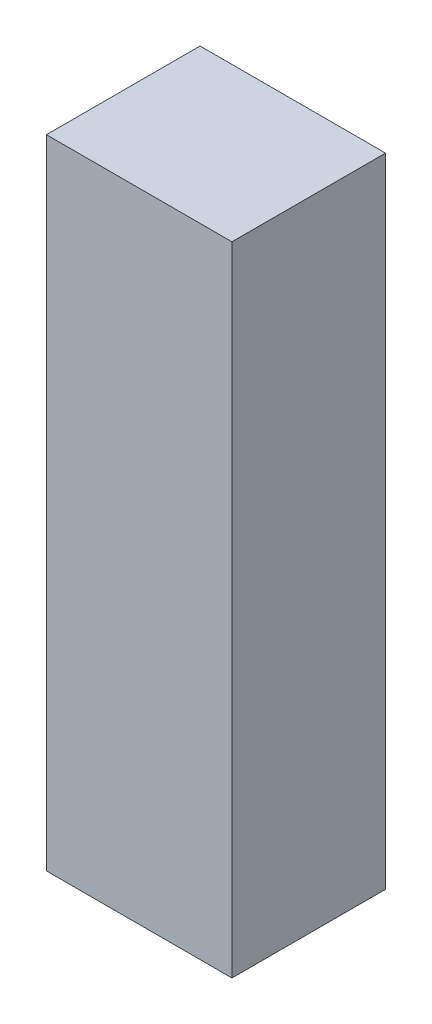
ISO-10303-21;
HEADER;
FILE_DESCRIPTION(('STEP AP214'),'2;1');
FILE_NAME('part.step','',(''),(''),'','','');
FILE_SCHEMA(('AUTOMOTIVE_DESIGN { 1 0 10303 214 1 1 1 1 }'));
ENDSEC;
DATA;
#1=APPLICATION_CONTEXT('core data for automotive mechanical design processes');
#2=APPLICATION_PROTOCOL_DEFINITION('international standard','automotive_design',2000,#1);
#3=PRODUCT_CONTEXT('',#1,'mechanical');
#4=PRODUCT('Part','Part','',(#3));
#5=PRODUCT_RELATED_PRODUCT_CATEGORY('part','',(#4));
#6=PRODUCT_DEFINITION_FORMATION('','',#4);
#7=PRODUCT_DEFINITION_CONTEXT('part definition',#1,'design');
#8=PRODUCT_DEFINITION('design','',#6,#7);
#9=PRODUCT_DEFINITION_SHAPE('','',#8);
#10=(LENGTH_UNIT() NAMED_UNIT(*) SI_UNIT(.MILLI.,.METRE.));
#11=(NAMED_UNIT(*) PLANE_ANGLE_UNIT() SI_UNIT($,.RADIAN.));
#12=(NAMED_UNIT(*) SI_UNIT($,.STERADIAN.) SOLID_ANGLE_UNIT());
#13=UNCERTAINTY_MEASURE_WITH_UNIT(LENGTH_MEASURE(1.E-05),#10,'distance_accuracy_value','');
#14=(GEOMETRIC_REPRESENTATION_CONTEXT(3) GLOBAL_UNCERTAINTY_ASSIGNED_CONTEXT((#13)) GLOBAL_UNIT_ASSIGNED_CONTEXT((#10,
#11,#12)) REPRESENTATION_CONTEXT('',''));
#15=CARTESIAN_POINT('',(0.,0.,0.));
#16=DIRECTION('',(0.,0.,1.));
#17=DIRECTION('',(1.,0.,0.));
#18=AXIS2_PLACEMENT_3D('',#15,#16,#17);
#19=CARTESIAN_POINT('',(-16.,55.,26.5));
#20=DIRECTION('',(1.,0.,0.));
#21=DIRECTION('',(0.,1.,0.));
#22=AXIS2_PLACEMENT_3D('',#19,#20,#21);
#23=PLANE('',#22);
#24=DIRECTION('',(0.,-1.,0.));
#25=VECTOR('',#24,1.);
#26=CARTESIAN_POINT('',(-16.,55.,0.));
#27=LINE('',#26,#25);
#28=CARTESIAN_POINT('',(-16.,55.,0.));
#29=VERTEX_POINT('',#28);
#30=CARTESIAN_POINT('',(-16.,-55.,0.));
#31=VERTEX_POINT('',#30);
#32=EDGE_CURVE('E107',#29,#31,#27,.T.);
#33=ORIENTED_EDGE('',*,*,#32,.T.);
#34=DIRECTION('',(0.,0.,-1.));
#35=VECTOR('',#34,1.);
#36=CARTESIAN_POINT('',(-16.,-55.,26.5));
#37=LINE('',#36,#35);
#38=CARTESIAN_POINT('',(-16.,-55.,26.5));
#39=VERTEX_POINT('',#38);
#40=EDGE_CURVE('E11',#39,#31,#37,.T.);
#41=ORIENTED_EDGE('',*,*,#40,.F.);
#42=DIRECTION('',(0.,-1.,0.));
#43=VECTOR('',#42,1.);
#44=CARTESIAN_POINT('',(-16.,55.,26.5));
#45=LINE('',#44,#43);
#46=CARTESIAN_POINT('',(-16.,55.,26.5));
#47=VERTEX_POINT('',#46);
#48=EDGE_CURVE('E91',#47,#39,#45,.T.);
#49=ORIENTED_EDGE('',*,*,#48,.F.);
#50=DIRECTION('',(0.,0.,-1.));
#51=VECTOR('',#50,1.);
#52=CARTESIAN_POINT('',(-16.,55.,26.5));
#53=LINE('',#52,#51);
#54=EDGE_CURVE('E103',#47,#29,#53,.T.);
#55=ORIENTED_EDGE('',*,*,#54,.T.);
#56=EDGE_LOOP('',(#33,#41,#49,#55));
#57=FACE_BOUND('',#56,.T.);
#58=ADVANCED_FACE('F39',(#57),#23,.F.);
#59=CARTESIAN_POINT('',(16.,-55.,26.5));
#60=DIRECTION('',(0.,1.,0.));
#61=DIRECTION('',(0.,0.,1.));
#62=AXIS2_PLACEMENT_3D('',#59,#60,#61);
#63=PLANE('',#62);
#64=DIRECTION('',(1.,0.,0.));
#65=VECTOR('',#64,1.);
#66=CARTESIAN_POINT('',(16.,-55.,0.));
#67=LINE('',#66,#65);
#68=CARTESIAN_POINT('',(16.,-55.,0.));
#69=VERTEX_POINT('',#68);
#70=EDGE_CURVE('E96',#31,#69,#67,.T.);
#71=ORIENTED_EDGE('',*,*,#70,.T.);
#72=DIRECTION('',(0.,0.,-1.));
#73=VECTOR('',#72,1.);
#74=CARTESIAN_POINT('',(16.,-55.,26.5));
#75=LINE('',#74,#73);
#76=CARTESIAN_POINT('',(16.,-55.,26.5));
#77=VERTEX_POINT('',#76);
#78=EDGE_CURVE('E48',#77,#69,#75,.T.);
#79=ORIENTED_EDGE('',*,*,#78,.F.);
#80=DIRECTION('',(1.,0.,0.));
#81=VECTOR('',#80,1.);
#82=CARTESIAN_POINT('',(16.,-55.,26.5));
#83=LINE('',#82,#81);
#84=EDGE_CURVE('E86',#39,#77,#83,.T.);
#85=ORIENTED_EDGE('',*,*,#84,.F.);
#86=ORIENTED_EDGE('',*,*,#40,.T.);
#87=EDGE_LOOP('',(#71,#79,#85,#86));
#88=FACE_BOUND('',#87,.T.);
#89=ADVANCED_FACE('F95',(#88),#63,.F.);
#90=CARTESIAN_POINT('',(16.,55.,26.5));
#91=DIRECTION('',(-1.,0.,0.));
#92=DIRECTION('',(0.,-1.,0.));
#93=AXIS2_PLACEMENT_3D('',#90,#91,#92);
#94=PLANE('',#93);
#95=DIRECTION('',(0.,1.,0.));
#96=VECTOR('',#95,1.);
#97=CARTESIAN_POINT('',(16.,55.,0.));
#98=LINE('',#97,#96);
#99=CARTESIAN_POINT('',(16.,55.,0.));
#100=VERTEX_POINT('',#99);
#101=EDGE_CURVE('E73',#69,#100,#98,.T.);
#102=ORIENTED_EDGE('',*,*,#101,.T.);
#103=DIRECTION('',(0.,0.,-1.));
#104=VECTOR('',#103,1.);
#105=CARTESIAN_POINT('',(16.,55.,26.5));
#106=LINE('',#105,#104);
#107=CARTESIAN_POINT('',(16.,55.,26.5));
#108=VERTEX_POINT('',#107);
#109=EDGE_CURVE('E98',#108,#100,#106,.T.);
#110=ORIENTED_EDGE('',*,*,#109,.F.);
#111=DIRECTION('',(0.,1.,0.));
#112=VECTOR('',#111,1.);
#113=CARTESIAN_POINT('',(16.,55.,26.5));
#114=LINE('',#113,#112);
#115=EDGE_CURVE('E89',#77,#108,#114,.T.);
#116=ORIENTED_EDGE('',*,*,#115,.F.);
#117=ORIENTED_EDGE('',*,*,#78,.T.);
#118=EDGE_LOOP('',(#102,#110,#116,#117));
#119=FACE_BOUND('',#118,.T.);
#120=ADVANCED_FACE('F99',(#119),#94,.F.);
#121=CARTESIAN_POINT('',(16.,55.,26.5));
#122=DIRECTION('',(0.,-1.,0.));
#123=DIRECTION('',(0.,0.,-1.));
#124=AXIS2_PLACEMENT_3D('',#121,#122,#123);
#125=PLANE('',#124);
#126=DIRECTION('',(-1.,0.,0.));
#127=VECTOR('',#126,1.);
#128=CARTESIAN_POINT('',(16.,55.,0.));
#129=LINE('',#128,#127);
#130=EDGE_CURVE('E79',#100,#29,#129,.T.);
#131=ORIENTED_EDGE('',*,*,#130,.T.);
#132=ORIENTED_EDGE('',*,*,#54,.F.);
#133=DIRECTION('',(-1.,0.,0.));
#134=VECTOR('',#133,1.);
#135=CARTESIAN_POINT('',(16.,55.,26.5));
#136=LINE('',#135,#134);
#137=EDGE_CURVE('E56',#108,#47,#136,.T.);
#138=ORIENTED_EDGE('',*,*,#137,.F.);
#139=ORIENTED_EDGE('',*,*,#109,.T.);
#140=EDGE_LOOP('',(#131,#132,#138,#139));
#141=FACE_BOUND('',#140,.T.);
#142=ADVANCED_FACE('F120',(#141),#125,.F.);
#143=CARTESIAN_POINT('',(0.,0.,26.5));
#144=DIRECTION('',(0.,0.,-1.));
#145=DIRECTION('',(-1.,0.,0.));
#146=AXIS2_PLACEMENT_3D('',#143,#144,#145);
#147=PLANE('',#146);
#148=ORIENTED_EDGE('',*,*,#48,.T.);
#149=ORIENTED_EDGE('',*,*,#84,.T.);
#150=ORIENTED_EDGE('',*,*,#115,.T.);
#151=ORIENTED_EDGE('',*,*,#137,.T.);
#152=EDGE_LOOP('',(#148,#149,#150,#151));
#153=FACE_BOUND('',#152,.T.);
#154=ADVANCED_FACE('F87',(#153),#147,.F.);
#155=CARTESIAN_POINT('',(0.,0.,0.));
#156=DIRECTION('',(0.,0.,-1.));
#157=DIRECTION('',(-1.,0.,0.));
#158=AXIS2_PLACEMENT_3D('',#155,#156,#157);
#159=PLANE('',#158);
#160=ORIENTED_EDGE('',*,*,#32,.F.);
#161=ORIENTED_EDGE('',*,*,#130,.F.);
#162=ORIENTED_EDGE('',*,*,#101,.F.);
#163=ORIENTED_EDGE('',*,*,#70,.F.);
#164=EDGE_LOOP('',(#160,#161,#162,#163));
#165=FACE_BOUND('',#164,.T.);
#166=ADVANCED_FACE('F123',(#165),#159,.T.);
#167=CLOSED_SHELL('',(#58,#89,#120,#142,#154,#166));
#168=MANIFOLD_SOLID_BREP('B2',#167);
#169=ADVANCED_BREP_SHAPE_REPRESENTATION('',(#18,#168),#14);
#170=SHAPE_DEFINITION_REPRESENTATION(#9,#169);
ENDSEC;
END-ISO-10303-21;
